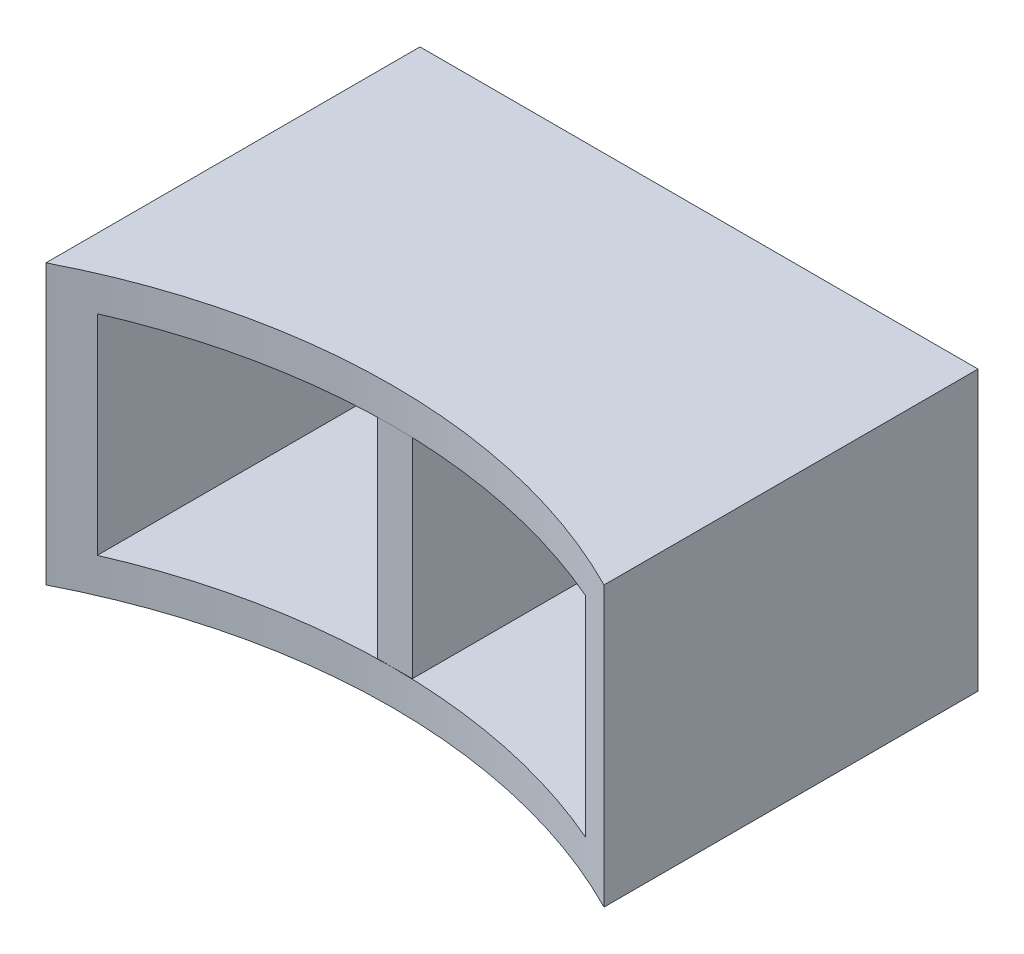
ISO-10303-21;
HEADER;
FILE_DESCRIPTION(('STEP AP214'),'2;1');
FILE_NAME('part.step','',(''),(''),'','','');
FILE_SCHEMA(('AUTOMOTIVE_DESIGN { 1 0 10303 214 1 1 1 1 }'));
ENDSEC;
DATA;
#1=APPLICATION_CONTEXT('core data for automotive mechanical design processes');
#2=APPLICATION_PROTOCOL_DEFINITION('international standard','automotive_design',2000,#1);
#3=PRODUCT_CONTEXT('',#1,'mechanical');
#4=PRODUCT('Part','Part','',(#3));
#5=PRODUCT_RELATED_PRODUCT_CATEGORY('part','',(#4));
#6=PRODUCT_DEFINITION_FORMATION('','',#4);
#7=PRODUCT_DEFINITION_CONTEXT('part definition',#1,'design');
#8=PRODUCT_DEFINITION('design','',#6,#7);
#9=PRODUCT_DEFINITION_SHAPE('','',#8);
#10=(LENGTH_UNIT() NAMED_UNIT(*) SI_UNIT(.MILLI.,.METRE.));
#11=(NAMED_UNIT(*) PLANE_ANGLE_UNIT() SI_UNIT($,.RADIAN.));
#12=(NAMED_UNIT(*) SI_UNIT($,.STERADIAN.) SOLID_ANGLE_UNIT());
#13=UNCERTAINTY_MEASURE_WITH_UNIT(LENGTH_MEASURE(1.E-05),#10,'distance_accuracy_value','');
#14=(GEOMETRIC_REPRESENTATION_CONTEXT(3) GLOBAL_UNCERTAINTY_ASSIGNED_CONTEXT((#13)) GLOBAL_UNIT_ASSIGNED_CONTEXT((#10,
#11,#12)) REPRESENTATION_CONTEXT('',''));
#15=CARTESIAN_POINT('',(0.,0.,0.));
#16=DIRECTION('',(0.,0.,1.));
#17=DIRECTION('',(1.,0.,0.));
#18=AXIS2_PLACEMENT_3D('',#15,#16,#17);
#19=CARTESIAN_POINT('',(-16.2625507738599,3.175,0.));
#20=DIRECTION('',(0.,-1.,0.));
#21=DIRECTION('',(1.,0.,0.));
#22=AXIS2_PLACEMENT_3D('',#19,#20,#21);
#23=PLANE('',#22);
#24=DIRECTION('',(-1.,0.,0.));
#25=VECTOR('',#24,1.);
#26=CARTESIAN_POINT('',(-16.2625507738599,3.175,-30.8709795775009));
#27=LINE('',#26,#25);
#28=CARTESIAN_POINT('',(28.1874492261401,3.17499999999999,-30.8709795775009));
#29=VERTEX_POINT('',#28);
#30=CARTESIAN_POINT('',(7.80242522614009,3.175,-30.8709795775009));
#31=VERTEX_POINT('',#30);
#32=EDGE_CURVE('E146',#29,#31,#27,.T.);
#33=ORIENTED_EDGE('',*,*,#32,.T.);
#34=DIRECTION('',(0.,0.,1.));
#35=VECTOR('',#34,1.);
#36=CARTESIAN_POINT('',(7.80242522614009,3.175,0.));
#37=LINE('',#36,#35);
#38=CARTESIAN_POINT('',(7.80242522614009,3.175,-6.10597957750093));
#39=VERTEX_POINT('',#38);
#40=EDGE_CURVE('E56',#31,#39,#37,.T.);
#41=ORIENTED_EDGE('',*,*,#40,.T.);
#42=DIRECTION('',(1.,0.,0.));
#43=VECTOR('',#42,1.);
#44=CARTESIAN_POINT('',(-16.2625507738599,3.175,-6.10597957750093));
#45=LINE('',#44,#43);
#46=CARTESIAN_POINT('',(5.96168722614007,3.175,-6.10597957750093));
#47=VERTEX_POINT('',#46);
#48=EDGE_CURVE('E227',#47,#39,#45,.T.);
#49=ORIENTED_EDGE('',*,*,#48,.F.);
#50=CARTESIAN_POINT('',(5.96168722614007,3.175,49.7740204224991));
#51=DIRECTION('',(0.,-1.,0.));
#52=DIRECTION('',(1.,0.,0.));
#53=AXIS2_PLACEMENT_3D('',#50,#51,#52);
#54=CIRCLE('',#53,55.88);
#55=CARTESIAN_POINT('',(28.1874492261401,3.17499999999999,-1.49575530862107));
#56=VERTEX_POINT('',#55);
#57=EDGE_CURVE('E167',#47,#56,#54,.T.);
#58=ORIENTED_EDGE('',*,*,#57,.T.);
#59=DIRECTION('',(0.,0.,-1.));
#60=VECTOR('',#59,1.);
#61=CARTESIAN_POINT('',(28.1874492261401,3.17499999999999,0.));
#62=LINE('',#61,#60);
#63=EDGE_CURVE('E218',#56,#29,#62,.T.);
#64=ORIENTED_EDGE('',*,*,#63,.T.);
#65=EDGE_LOOP('',(#33,#41,#49,#58,#64));
#66=FACE_BOUND('',#65,.T.);
#67=ADVANCED_FACE('F33',(#66),#23,.F.);
#68=CARTESIAN_POINT('',(-16.2625507738599,22.225,0.));
#69=DIRECTION('',(0.,1.,0.));
#70=DIRECTION('',(-1.,0.,0.));
#71=AXIS2_PLACEMENT_3D('',#68,#69,#70);
#72=PLANE('',#71);
#73=DIRECTION('',(-1.,0.,0.));
#74=VECTOR('',#73,1.);
#75=CARTESIAN_POINT('',(-16.2625507738599,22.225,-6.10597957750093));
#76=LINE('',#75,#74);
#77=CARTESIAN_POINT('',(7.80242522614009,22.225,-6.10597957750093));
#78=VERTEX_POINT('',#77);
#79=CARTESIAN_POINT('',(5.96168722614007,22.225,-6.10597957750093));
#80=VERTEX_POINT('',#79);
#81=EDGE_CURVE('E11',#78,#80,#76,.T.);
#82=ORIENTED_EDGE('',*,*,#81,.F.);
#83=DIRECTION('',(0.,0.,-1.));
#84=VECTOR('',#83,1.);
#85=CARTESIAN_POINT('',(7.80242522614009,22.225,0.));
#86=LINE('',#85,#84);
#87=CARTESIAN_POINT('',(7.80242522614009,22.225,-30.8709795775009));
#88=VERTEX_POINT('',#87);
#89=EDGE_CURVE('E154',#78,#88,#86,.T.);
#90=ORIENTED_EDGE('',*,*,#89,.T.);
#91=DIRECTION('',(1.,0.,0.));
#92=VECTOR('',#91,1.);
#93=CARTESIAN_POINT('',(-16.2625507738599,22.225,-30.8709795775009));
#94=LINE('',#93,#92);
#95=CARTESIAN_POINT('',(28.1874492261401,22.225,-30.8709795775009));
#96=VERTEX_POINT('',#95);
#97=EDGE_CURVE('E225',#88,#96,#94,.T.);
#98=ORIENTED_EDGE('',*,*,#97,.T.);
#99=DIRECTION('',(0.,0.,-1.));
#100=VECTOR('',#99,1.);
#101=CARTESIAN_POINT('',(28.1874492261401,22.225,0.));
#102=LINE('',#101,#100);
#103=CARTESIAN_POINT('',(28.1874492261401,22.225,-1.49575530862107));
#104=VERTEX_POINT('',#103);
#105=EDGE_CURVE('E215',#104,#96,#102,.T.);
#106=ORIENTED_EDGE('',*,*,#105,.F.);
#107=CARTESIAN_POINT('',(5.96168722614007,22.225,49.7740204224991));
#108=DIRECTION('',(0.,1.,0.));
#109=DIRECTION('',(-1.,0.,0.));
#110=AXIS2_PLACEMENT_3D('',#107,#108,#109);
#111=CIRCLE('',#110,55.88);
#112=EDGE_CURVE('E171',#104,#80,#111,.T.);
#113=ORIENTED_EDGE('',*,*,#112,.T.);
#114=EDGE_LOOP('',(#82,#90,#98,#106,#113));
#115=FACE_BOUND('',#114,.T.);
#116=ADVANCED_FACE('F257',(#115),#72,.F.);
#117=CARTESIAN_POINT('',(-16.2625507738599,3.175,-30.8709795775009));
#118=DIRECTION('',(0.,0.,1.));
#119=DIRECTION('',(1.,0.,0.));
#120=AXIS2_PLACEMENT_3D('',#117,#118,#119);
#121=PLANE('',#120);
#122=DIRECTION('',(0.,1.,0.));
#123=VECTOR('',#122,1.);
#124=CARTESIAN_POINT('',(7.80242522614009,3.175,-30.8709795775009));
#125=LINE('',#124,#123);
#126=EDGE_CURVE('E159',#31,#88,#125,.T.);
#127=ORIENTED_EDGE('',*,*,#126,.F.);
#128=ORIENTED_EDGE('',*,*,#32,.F.);
#129=DIRECTION('',(0.,-1.,0.));
#130=VECTOR('',#129,1.);
#131=CARTESIAN_POINT('',(28.1874492261401,22.225,-30.8709795775009));
#132=LINE('',#131,#130);
#133=EDGE_CURVE('E147',#96,#29,#132,.T.);
#134=ORIENTED_EDGE('',*,*,#133,.F.);
#135=ORIENTED_EDGE('',*,*,#97,.F.);
#136=EDGE_LOOP('',(#127,#128,#134,#135));
#137=FACE_BOUND('',#136,.T.);
#138=ADVANCED_FACE('F264',(#137),#121,.T.);
#139=CARTESIAN_POINT('',(5.96168722614007,25.4,49.7740204224991));
#140=DIRECTION('',(0.,-1.,0.));
#141=DIRECTION('',(0.,0.,-1.));
#142=AXIS2_PLACEMENT_3D('',#139,#140,#141);
#143=CYLINDRICAL_SURFACE('',#142,55.88);
#144=CARTESIAN_POINT('',(-16.2625507738599,22.225,-1.49641594505446));
#145=VERTEX_POINT('',#144);
#146=EDGE_CURVE('E174',#80,#145,#111,.T.);
#147=ORIENTED_EDGE('',*,*,#146,.F.);
#148=ORIENTED_EDGE('',*,*,#112,.F.);
#149=DIRECTION('',(0.,-1.,0.));
#150=VECTOR('',#149,1.);
#151=CARTESIAN_POINT('',(28.1874492261401,25.4,-1.49575530862107));
#152=LINE('',#151,#150);
#153=EDGE_CURVE('E168',#56,#104,#152,.F.);
#154=ORIENTED_EDGE('',*,*,#153,.F.);
#155=ORIENTED_EDGE('',*,*,#57,.F.);
#156=CARTESIAN_POINT('',(-16.2625507738599,3.175,-1.49641594505446));
#157=VERTEX_POINT('',#156);
#158=EDGE_CURVE('E163',#157,#47,#54,.T.);
#159=ORIENTED_EDGE('',*,*,#158,.F.);
#160=DIRECTION('',(0.,-1.,0.));
#161=VECTOR('',#160,1.);
#162=CARTESIAN_POINT('',(-16.2625507738599,25.4,-1.49641594505446));
#163=LINE('',#162,#161);
#164=EDGE_CURVE('E160',#145,#157,#163,.T.);
#165=ORIENTED_EDGE('',*,*,#164,.F.);
#166=EDGE_LOOP('',(#147,#148,#154,#155,#159,#165));
#167=FACE_BOUND('',#166,.T.);
#168=CARTESIAN_POINT('',(5.96168722614007,25.4,49.7740204224991));
#169=DIRECTION('',(0.,1.,0.));
#170=DIRECTION('',(0.,0.,1.));
#171=AXIS2_PLACEMENT_3D('',#168,#169,#170);
#172=CIRCLE('',#171,55.88);
#173=CARTESIAN_POINT('',(31.3609252261401,25.4,0.));
#174=VERTEX_POINT('',#173);
#175=CARTESIAN_POINT('',(-19.4375507738599,25.4,0.));
#176=VERTEX_POINT('',#175);
#177=EDGE_CURVE('E192',#174,#176,#172,.T.);
#178=ORIENTED_EDGE('',*,*,#177,.T.);
#179=DIRECTION('',(0.,-1.,0.));
#180=VECTOR('',#179,1.);
#181=CARTESIAN_POINT('',(-19.4375507738599,25.4,0.));
#182=LINE('',#181,#180);
#183=CARTESIAN_POINT('',(-19.4375507738599,0.,0.));
#184=VERTEX_POINT('',#183);
#185=EDGE_CURVE('E185',#176,#184,#182,.T.);
#186=ORIENTED_EDGE('',*,*,#185,.T.);
#187=CARTESIAN_POINT('',(5.96168722614007,0.,49.7740204224991));
#188=DIRECTION('',(0.,1.,0.));
#189=DIRECTION('',(0.,0.,1.));
#190=AXIS2_PLACEMENT_3D('',#187,#188,#189);
#191=CIRCLE('',#190,55.88);
#192=CARTESIAN_POINT('',(31.3609252261401,0.,0.));
#193=VERTEX_POINT('',#192);
#194=EDGE_CURVE('E200',#193,#184,#191,.T.);
#195=ORIENTED_EDGE('',*,*,#194,.F.);
#196=DIRECTION('',(0.,-1.,0.));
#197=VECTOR('',#196,1.);
#198=CARTESIAN_POINT('',(31.3609252261401,25.4,0.));
#199=LINE('',#198,#197);
#200=EDGE_CURVE('E175',#174,#193,#199,.T.);
#201=ORIENTED_EDGE('',*,*,#200,.F.);
#202=EDGE_LOOP('',(#178,#186,#195,#201));
#203=FACE_BOUND('',#202,.T.);
#204=ADVANCED_FACE('F35',(#167,#203),#143,.F.);
#205=CARTESIAN_POINT('',(31.36092522614,25.4,35.8040204224991));
#206=DIRECTION('',(1.,0.,0.));
#207=DIRECTION('',(0.,0.,-1.));
#208=AXIS2_PLACEMENT_3D('',#205,#206,#207);
#209=PLANE('',#208);
#210=DIRECTION('',(0.,0.,1.));
#211=VECTOR('',#210,1.);
#212=CARTESIAN_POINT('',(31.36092522614,0.,35.8040204224991));
#213=LINE('',#212,#211);
#214=CARTESIAN_POINT('',(31.3609252261401,0.,-34.0459795775009));
#215=VERTEX_POINT('',#214);
#216=EDGE_CURVE('E197',#215,#193,#213,.T.);
#217=ORIENTED_EDGE('',*,*,#216,.F.);
#218=DIRECTION('',(0.,-1.,0.));
#219=VECTOR('',#218,1.);
#220=CARTESIAN_POINT('',(31.3609252261401,25.4,-34.0459795775009));
#221=LINE('',#220,#219);
#222=CARTESIAN_POINT('',(31.3609252261401,25.4,-34.0459795775009));
#223=VERTEX_POINT('',#222);
#224=EDGE_CURVE('E177',#223,#215,#221,.T.);
#225=ORIENTED_EDGE('',*,*,#224,.F.);
#226=DIRECTION('',(0.,0.,1.));
#227=VECTOR('',#226,1.);
#228=CARTESIAN_POINT('',(31.36092522614,25.4,35.8040204224991));
#229=LINE('',#228,#227);
#230=EDGE_CURVE('E209',#223,#174,#229,.T.);
#231=ORIENTED_EDGE('',*,*,#230,.T.);
#232=ORIENTED_EDGE('',*,*,#200,.T.);
#233=EDGE_LOOP('',(#217,#225,#231,#232));
#234=FACE_BOUND('',#233,.T.);
#235=ADVANCED_FACE('F271',(#234),#209,.T.);
#236=CARTESIAN_POINT('',(-218.853109277033,25.4,-34.0459795775009));
#237=DIRECTION('',(0.,0.,-1.));
#238=DIRECTION('',(-1.,0.,0.));
#239=AXIS2_PLACEMENT_3D('',#236,#237,#238);
#240=PLANE('',#239);
#241=DIRECTION('',(1.,0.,0.));
#242=VECTOR('',#241,1.);
#243=CARTESIAN_POINT('',(-218.853109277033,25.4,-34.0459795775009));
#244=LINE('',#243,#242);
#245=CARTESIAN_POINT('',(-19.43907477386,25.4,-34.0459795775009));
#246=VERTEX_POINT('',#245);
#247=EDGE_CURVE('E207',#246,#223,#244,.T.);
#248=ORIENTED_EDGE('',*,*,#247,.T.);
#249=ORIENTED_EDGE('',*,*,#224,.T.);
#250=DIRECTION('',(1.,0.,0.));
#251=VECTOR('',#250,1.);
#252=CARTESIAN_POINT('',(-218.853109277033,0.,-34.0459795775009));
#253=LINE('',#252,#251);
#254=CARTESIAN_POINT('',(-19.43907477386,0.,-34.0459795775009));
#255=VERTEX_POINT('',#254);
#256=EDGE_CURVE('E195',#255,#215,#253,.T.);
#257=ORIENTED_EDGE('',*,*,#256,.F.);
#258=DIRECTION('',(0.,-1.,0.));
#259=VECTOR('',#258,1.);
#260=CARTESIAN_POINT('',(-19.43907477386,25.4,-34.0459795775009));
#261=LINE('',#260,#259);
#262=EDGE_CURVE('E180',#246,#255,#261,.T.);
#263=ORIENTED_EDGE('',*,*,#262,.F.);
#264=EDGE_LOOP('',(#248,#249,#257,#263));
#265=FACE_BOUND('',#264,.T.);
#266=ADVANCED_FACE('F305',(#265),#240,.T.);
#267=CARTESIAN_POINT('',(-19.43907477386,25.4,35.8040204224991));
#268=DIRECTION('',(1.,0.,0.));
#269=DIRECTION('',(0.,0.,-1.));
#270=AXIS2_PLACEMENT_3D('',#267,#268,#269);
#271=PLANE('',#270);
#272=DIRECTION('',(0.,0.,1.));
#273=VECTOR('',#272,1.);
#274=CARTESIAN_POINT('',(-19.43907477386,0.,35.8040204224991));
#275=LINE('',#274,#273);
#276=CARTESIAN_POINT('',(-19.43907477386,0.,0.));
#277=VERTEX_POINT('',#276);
#278=EDGE_CURVE('E193',#255,#277,#275,.T.);
#279=ORIENTED_EDGE('',*,*,#278,.T.);
#280=DIRECTION('',(0.,-1.,0.));
#281=VECTOR('',#280,1.);
#282=CARTESIAN_POINT('',(-19.43907477386,25.4,0.));
#283=LINE('',#282,#281);
#284=CARTESIAN_POINT('',(-19.43907477386,25.4,0.));
#285=VERTEX_POINT('',#284);
#286=EDGE_CURVE('E182',#285,#277,#283,.T.);
#287=ORIENTED_EDGE('',*,*,#286,.F.);
#288=DIRECTION('',(0.,0.,1.));
#289=VECTOR('',#288,1.);
#290=CARTESIAN_POINT('',(-19.43907477386,25.4,35.8040204224991));
#291=LINE('',#290,#289);
#292=EDGE_CURVE('E205',#246,#285,#291,.T.);
#293=ORIENTED_EDGE('',*,*,#292,.F.);
#294=ORIENTED_EDGE('',*,*,#262,.T.);
#295=EDGE_LOOP('',(#279,#287,#293,#294));
#296=FACE_BOUND('',#295,.T.);
#297=ADVANCED_FACE('F301',(#296),#271,.F.);
#298=CARTESIAN_POINT('',(-218.853109277033,25.4,0.));
#299=DIRECTION('',(0.,0.,-1.));
#300=DIRECTION('',(-1.,0.,0.));
#301=AXIS2_PLACEMENT_3D('',#298,#299,#300);
#302=PLANE('',#301);
#303=DIRECTION('',(1.,0.,0.));
#304=VECTOR('',#303,1.);
#305=CARTESIAN_POINT('',(-218.853109277033,0.,0.));
#306=LINE('',#305,#304);
#307=EDGE_CURVE('E189',#277,#184,#306,.T.);
#308=ORIENTED_EDGE('',*,*,#307,.T.);
#309=ORIENTED_EDGE('',*,*,#185,.F.);
#310=DIRECTION('',(1.,0.,0.));
#311=VECTOR('',#310,1.);
#312=CARTESIAN_POINT('',(-218.853109277033,25.4,0.));
#313=LINE('',#312,#311);
#314=EDGE_CURVE('E188',#285,#176,#313,.T.);
#315=ORIENTED_EDGE('',*,*,#314,.F.);
#316=ORIENTED_EDGE('',*,*,#286,.T.);
#317=EDGE_LOOP('',(#308,#309,#315,#316));
#318=FACE_BOUND('',#317,.T.);
#319=ADVANCED_FACE('F296',(#318),#302,.F.);
#320=CARTESIAN_POINT('',(-218.853109277033,25.4,35.8040204224991));
#321=DIRECTION('',(0.,1.,0.));
#322=DIRECTION('',(0.,0.,1.));
#323=AXIS2_PLACEMENT_3D('',#320,#321,#322);
#324=PLANE('',#323);
#325=ORIENTED_EDGE('',*,*,#230,.F.);
#326=ORIENTED_EDGE('',*,*,#247,.F.);
#327=ORIENTED_EDGE('',*,*,#292,.T.);
#328=ORIENTED_EDGE('',*,*,#314,.T.);
#329=ORIENTED_EDGE('',*,*,#177,.F.);
#330=EDGE_LOOP('',(#325,#326,#327,#328,#329));
#331=FACE_BOUND('',#330,.T.);
#332=ADVANCED_FACE('F291',(#331),#324,.T.);
#333=CARTESIAN_POINT('',(-218.853109277033,0.,35.8040204224991));
#334=DIRECTION('',(0.,1.,0.));
#335=DIRECTION('',(0.,0.,1.));
#336=AXIS2_PLACEMENT_3D('',#333,#334,#335);
#337=PLANE('',#336);
#338=ORIENTED_EDGE('',*,*,#256,.T.);
#339=ORIENTED_EDGE('',*,*,#216,.T.);
#340=ORIENTED_EDGE('',*,*,#194,.T.);
#341=ORIENTED_EDGE('',*,*,#307,.F.);
#342=ORIENTED_EDGE('',*,*,#278,.F.);
#343=EDGE_LOOP('',(#338,#339,#340,#341,#342));
#344=FACE_BOUND('',#343,.T.);
#345=ADVANCED_FACE('F286',(#344),#337,.F.);
#346=CARTESIAN_POINT('',(-16.2625507738599,22.225,0.));
#347=DIRECTION('',(-1.,0.,0.));
#348=DIRECTION('',(0.,-1.,0.));
#349=AXIS2_PLACEMENT_3D('',#346,#347,#348);
#350=PLANE('',#349);
#351=ORIENTED_EDGE('',*,*,#164,.T.);
#352=DIRECTION('',(0.,0.,-1.));
#353=VECTOR('',#352,1.);
#354=CARTESIAN_POINT('',(-16.2625507738599,3.175,0.));
#355=LINE('',#354,#353);
#356=CARTESIAN_POINT('',(-16.2625507738599,3.175,-30.8709795775009));
#357=VERTEX_POINT('',#356);
#358=EDGE_CURVE('E202',#157,#357,#355,.T.);
#359=ORIENTED_EDGE('',*,*,#358,.T.);
#360=DIRECTION('',(0.,1.,0.));
#361=VECTOR('',#360,1.);
#362=CARTESIAN_POINT('',(-16.2625507738599,22.225,-30.8709795775009));
#363=LINE('',#362,#361);
#364=CARTESIAN_POINT('',(-16.2625507738599,22.225,-30.8709795775009));
#365=VERTEX_POINT('',#364);
#366=EDGE_CURVE('E143',#357,#365,#363,.T.);
#367=ORIENTED_EDGE('',*,*,#366,.T.);
#368=DIRECTION('',(0.,0.,-1.));
#369=VECTOR('',#368,1.);
#370=CARTESIAN_POINT('',(-16.2625507738599,22.225,0.));
#371=LINE('',#370,#369);
#372=EDGE_CURVE('E213',#145,#365,#371,.T.);
#373=ORIENTED_EDGE('',*,*,#372,.F.);
#374=EDGE_LOOP('',(#351,#359,#367,#373));
#375=FACE_BOUND('',#374,.T.);
#376=ADVANCED_FACE('F253',(#375),#350,.F.);
#377=CARTESIAN_POINT('',(4.62742522614009,3.175,-6.10597957750093));
#378=VERTEX_POINT('',#377);
#379=EDGE_CURVE('E48',#378,#47,#45,.T.);
#380=ORIENTED_EDGE('',*,*,#379,.F.);
#381=DIRECTION('',(0.,0.,-1.));
#382=VECTOR('',#381,1.);
#383=CARTESIAN_POINT('',(4.62742522614009,3.175,0.));
#384=LINE('',#383,#382);
#385=CARTESIAN_POINT('',(4.62742522614009,3.17499999999999,-30.8709795775009));
#386=VERTEX_POINT('',#385);
#387=EDGE_CURVE('E149',#378,#386,#384,.T.);
#388=ORIENTED_EDGE('',*,*,#387,.T.);
#389=EDGE_CURVE('E136',#386,#357,#27,.T.);
#390=ORIENTED_EDGE('',*,*,#389,.T.);
#391=ORIENTED_EDGE('',*,*,#358,.F.);
#392=ORIENTED_EDGE('',*,*,#158,.T.);
#393=EDGE_LOOP('',(#380,#388,#390,#391,#392));
#394=FACE_BOUND('',#393,.T.);
#395=ADVANCED_FACE('F150',(#394),#23,.F.);
#396=CARTESIAN_POINT('',(28.1874492261401,22.225,0.));
#397=DIRECTION('',(1.,0.,0.));
#398=DIRECTION('',(0.,1.,0.));
#399=AXIS2_PLACEMENT_3D('',#396,#397,#398);
#400=PLANE('',#399);
#401=ORIENTED_EDGE('',*,*,#153,.T.);
#402=ORIENTED_EDGE('',*,*,#105,.T.);
#403=ORIENTED_EDGE('',*,*,#133,.T.);
#404=ORIENTED_EDGE('',*,*,#63,.F.);
#405=EDGE_LOOP('',(#401,#402,#403,#404));
#406=FACE_BOUND('',#405,.T.);
#407=ADVANCED_FACE('F261',(#406),#400,.F.);
#408=CARTESIAN_POINT('',(4.62742522614009,22.225,-30.8709795775009));
#409=VERTEX_POINT('',#408);
#410=EDGE_CURVE('E223',#365,#409,#94,.T.);
#411=ORIENTED_EDGE('',*,*,#410,.T.);
#412=DIRECTION('',(0.,0.,1.));
#413=VECTOR('',#412,1.);
#414=CARTESIAN_POINT('',(4.62742522614009,22.225,0.));
#415=LINE('',#414,#413);
#416=CARTESIAN_POINT('',(4.62742522614009,22.225,-6.10597957750093));
#417=VERTEX_POINT('',#416);
#418=EDGE_CURVE('E155',#409,#417,#415,.T.);
#419=ORIENTED_EDGE('',*,*,#418,.T.);
#420=EDGE_CURVE('E37',#80,#417,#76,.T.);
#421=ORIENTED_EDGE('',*,*,#420,.F.);
#422=ORIENTED_EDGE('',*,*,#146,.T.);
#423=ORIENTED_EDGE('',*,*,#372,.T.);
#424=EDGE_LOOP('',(#411,#419,#421,#422,#423));
#425=FACE_BOUND('',#424,.T.);
#426=ADVANCED_FACE('F273',(#425),#72,.F.);
#427=DIRECTION('',(0.,-1.,0.));
#428=VECTOR('',#427,1.);
#429=CARTESIAN_POINT('',(4.62742522614009,3.175,-30.8709795775009));
#430=LINE('',#429,#428);
#431=EDGE_CURVE('E140',#409,#386,#430,.T.);
#432=ORIENTED_EDGE('',*,*,#431,.F.);
#433=ORIENTED_EDGE('',*,*,#410,.F.);
#434=ORIENTED_EDGE('',*,*,#366,.F.);
#435=ORIENTED_EDGE('',*,*,#389,.F.);
#436=EDGE_LOOP('',(#432,#433,#434,#435));
#437=FACE_BOUND('',#436,.T.);
#438=ADVANCED_FACE('F137',(#437),#121,.T.);
#439=CARTESIAN_POINT('',(7.80242522614009,0.,-6.10597957750093));
#440=DIRECTION('',(0.,0.,-1.));
#441=DIRECTION('',(-1.,0.,0.));
#442=AXIS2_PLACEMENT_3D('',#439,#440,#441);
#443=PLANE('',#442);
#444=DIRECTION('',(0.,1.,0.));
#445=VECTOR('',#444,1.);
#446=CARTESIAN_POINT('',(4.62742522614009,25.4,-6.10597957750093));
#447=LINE('',#446,#445);
#448=EDGE_CURVE('E232',#378,#417,#447,.T.);
#449=ORIENTED_EDGE('',*,*,#448,.F.);
#450=ORIENTED_EDGE('',*,*,#379,.T.);
#451=ORIENTED_EDGE('',*,*,#48,.T.);
#452=DIRECTION('',(0.,-1.,0.));
#453=VECTOR('',#452,1.);
#454=CARTESIAN_POINT('',(7.80242522614009,25.4,-6.10597957750093));
#455=LINE('',#454,#453);
#456=EDGE_CURVE('E234',#78,#39,#455,.T.);
#457=ORIENTED_EDGE('',*,*,#456,.F.);
#458=ORIENTED_EDGE('',*,*,#81,.T.);
#459=ORIENTED_EDGE('',*,*,#420,.T.);
#460=EDGE_LOOP('',(#449,#450,#451,#457,#458,#459));
#461=FACE_BOUND('',#460,.T.);
#462=ADVANCED_FACE('F241',(#461),#443,.F.);
#463=CARTESIAN_POINT('',(7.80242522614009,25.4,-6.10597957750093));
#464=DIRECTION('',(1.,0.,0.));
#465=DIRECTION('',(0.,1.,0.));
#466=AXIS2_PLACEMENT_3D('',#463,#464,#465);
#467=PLANE('',#466);
#468=ORIENTED_EDGE('',*,*,#40,.F.);
#469=ORIENTED_EDGE('',*,*,#126,.T.);
#470=ORIENTED_EDGE('',*,*,#89,.F.);
#471=ORIENTED_EDGE('',*,*,#456,.T.);
#472=EDGE_LOOP('',(#468,#469,#470,#471));
#473=FACE_BOUND('',#472,.T.);
#474=ADVANCED_FACE('F239',(#473),#467,.T.);
#475=CARTESIAN_POINT('',(4.62742522614009,25.4,-6.10597957750093));
#476=DIRECTION('',(-1.,0.,0.));
#477=DIRECTION('',(0.,-1.,0.));
#478=AXIS2_PLACEMENT_3D('',#475,#476,#477);
#479=PLANE('',#478);
#480=ORIENTED_EDGE('',*,*,#387,.F.);
#481=ORIENTED_EDGE('',*,*,#448,.T.);
#482=ORIENTED_EDGE('',*,*,#418,.F.);
#483=ORIENTED_EDGE('',*,*,#431,.T.);
#484=EDGE_LOOP('',(#480,#481,#482,#483));
#485=FACE_BOUND('',#484,.T.);
#486=ADVANCED_FACE('F158',(#485),#479,.T.);
#487=CLOSED_SHELL('',(#67,#116,#138,#204,#235,#266,#297,#319,#332,#345,#376,#395,#407,#426,#438,
#462,#474,#486));
#488=MANIFOLD_SOLID_BREP('B2',#487);
#489=ADVANCED_BREP_SHAPE_REPRESENTATION('',(#18,#488),#14);
#490=SHAPE_DEFINITION_REPRESENTATION(#9,#489);
ENDSEC;
END-ISO-10303-21;
